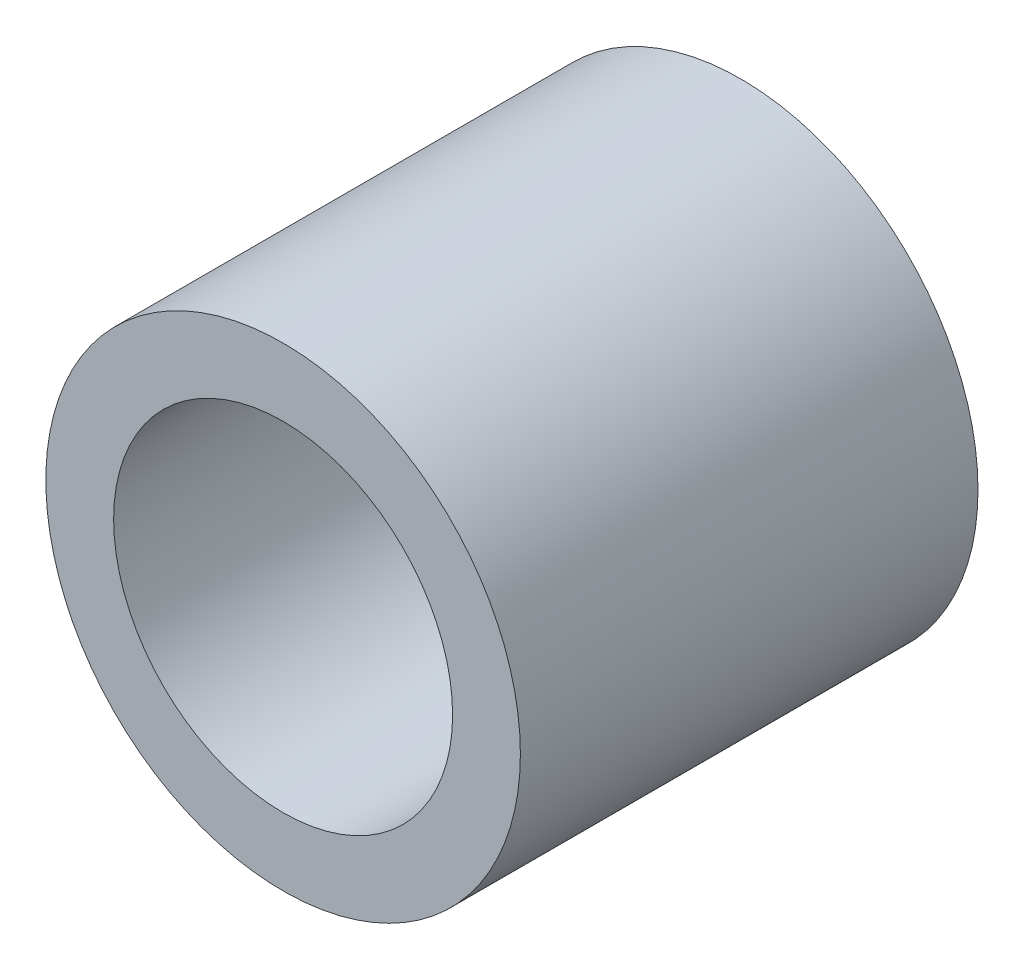
ISO-10303-21;
HEADER;
FILE_DESCRIPTION(('STEP AP214'),'2;1');
FILE_NAME('part.step','',(''),(''),'','','');
FILE_SCHEMA(('AUTOMOTIVE_DESIGN { 1 0 10303 214 1 1 1 1 }'));
ENDSEC;
DATA;
#1=APPLICATION_CONTEXT('core data for automotive mechanical design processes');
#2=APPLICATION_PROTOCOL_DEFINITION('international standard','automotive_design',2000,#1);
#3=PRODUCT_CONTEXT('',#1,'mechanical');
#4=PRODUCT('Part','Part','',(#3));
#5=PRODUCT_RELATED_PRODUCT_CATEGORY('part','',(#4));
#6=PRODUCT_DEFINITION_FORMATION('','',#4);
#7=PRODUCT_DEFINITION_CONTEXT('part definition',#1,'design');
#8=PRODUCT_DEFINITION('design','',#6,#7);
#9=PRODUCT_DEFINITION_SHAPE('','',#8);
#10=(LENGTH_UNIT() NAMED_UNIT(*) SI_UNIT(.MILLI.,.METRE.));
#11=(NAMED_UNIT(*) PLANE_ANGLE_UNIT() SI_UNIT($,.RADIAN.));
#12=(NAMED_UNIT(*) SI_UNIT($,.STERADIAN.) SOLID_ANGLE_UNIT());
#13=UNCERTAINTY_MEASURE_WITH_UNIT(LENGTH_MEASURE(1.E-05),#10,'distance_accuracy_value','');
#14=(GEOMETRIC_REPRESENTATION_CONTEXT(3) GLOBAL_UNCERTAINTY_ASSIGNED_CONTEXT((#13)) GLOBAL_UNIT_ASSIGNED_CONTEXT((#10,
#11,#12)) REPRESENTATION_CONTEXT('',''));
#15=CARTESIAN_POINT('',(0.,0.,0.));
#16=DIRECTION('',(0.,0.,1.));
#17=DIRECTION('',(1.,0.,0.));
#18=AXIS2_PLACEMENT_3D('',#15,#16,#17);
#19=CARTESIAN_POINT('',(0.,0.,6.75));
#20=DIRECTION('',(0.,0.,1.));
#21=DIRECTION('',(1.,0.,0.));
#22=AXIS2_PLACEMENT_3D('',#19,#20,#21);
#23=PLANE('',#22);
#24=CARTESIAN_POINT('',(0.,0.,6.75));
#25=DIRECTION('',(0.,0.,1.));
#26=DIRECTION('',(1.,0.,0.));
#27=AXIS2_PLACEMENT_3D('',#24,#25,#26);
#28=CIRCLE('',#27,3.5);
#29=CARTESIAN_POINT('',(3.5,0.,6.75));
#30=VERTEX_POINT('',#29);
#31=EDGE_CURVE('E10',#30,#30,#28,.T.);
#32=ORIENTED_EDGE('',*,*,#31,.T.);
#33=EDGE_LOOP('',(#32));
#34=FACE_BOUND('',#33,.T.);
#35=CARTESIAN_POINT('',(0.,0.,6.75));
#36=DIRECTION('',(0.,0.,1.));
#37=DIRECTION('',(1.,0.,0.));
#38=AXIS2_PLACEMENT_3D('',#35,#36,#37);
#39=CIRCLE('',#38,2.5);
#40=CARTESIAN_POINT('',(2.5,0.,6.75));
#41=VERTEX_POINT('',#40);
#42=EDGE_CURVE('E41',#41,#41,#39,.T.);
#43=ORIENTED_EDGE('',*,*,#42,.F.);
#44=EDGE_LOOP('',(#43));
#45=FACE_BOUND('',#44,.T.);
#46=ADVANCED_FACE('F30',(#34,#45),#23,.T.);
#47=CARTESIAN_POINT('',(0.,0.,0.));
#48=DIRECTION('',(0.,0.,1.));
#49=DIRECTION('',(1.,0.,0.));
#50=AXIS2_PLACEMENT_3D('',#47,#48,#49);
#51=PLANE('',#50);
#52=CARTESIAN_POINT('',(0.,0.,0.));
#53=DIRECTION('',(0.,0.,1.));
#54=DIRECTION('',(1.,0.,0.));
#55=AXIS2_PLACEMENT_3D('',#52,#53,#54);
#56=CIRCLE('',#55,3.5);
#57=CARTESIAN_POINT('',(3.5,0.,0.));
#58=VERTEX_POINT('',#57);
#59=EDGE_CURVE('E34',#58,#58,#56,.T.);
#60=ORIENTED_EDGE('',*,*,#59,.F.);
#61=EDGE_LOOP('',(#60));
#62=FACE_BOUND('',#61,.T.);
#63=CARTESIAN_POINT('',(0.,0.,0.));
#64=DIRECTION('',(0.,0.,1.));
#65=DIRECTION('',(1.,0.,0.));
#66=AXIS2_PLACEMENT_3D('',#63,#64,#65);
#67=CIRCLE('',#66,2.5);
#68=CARTESIAN_POINT('',(2.5,0.,0.));
#69=VERTEX_POINT('',#68);
#70=EDGE_CURVE('E43',#69,#69,#67,.T.);
#71=ORIENTED_EDGE('',*,*,#70,.T.);
#72=EDGE_LOOP('',(#71));
#73=FACE_BOUND('',#72,.T.);
#74=ADVANCED_FACE('F53',(#62,#73),#51,.F.);
#75=CARTESIAN_POINT('',(0.,0.,6.75));
#76=DIRECTION('',(0.,0.,-1.));
#77=DIRECTION('',(-1.,0.,0.));
#78=AXIS2_PLACEMENT_3D('',#75,#76,#77);
#79=CYLINDRICAL_SURFACE('',#78,3.5);
#80=ORIENTED_EDGE('',*,*,#31,.F.);
#81=EDGE_LOOP('',(#80));
#82=FACE_BOUND('',#81,.T.);
#83=ORIENTED_EDGE('',*,*,#59,.T.);
#84=EDGE_LOOP('',(#83));
#85=FACE_BOUND('',#84,.T.);
#86=ADVANCED_FACE('F32',(#82,#85),#79,.T.);
#87=CARTESIAN_POINT('',(0.,0.,6.75));
#88=DIRECTION('',(0.,0.,-1.));
#89=DIRECTION('',(-1.,0.,0.));
#90=AXIS2_PLACEMENT_3D('',#87,#88,#89);
#91=CYLINDRICAL_SURFACE('',#90,2.5);
#92=ORIENTED_EDGE('',*,*,#42,.T.);
#93=EDGE_LOOP('',(#92));
#94=FACE_BOUND('',#93,.T.);
#95=ORIENTED_EDGE('',*,*,#70,.F.);
#96=EDGE_LOOP('',(#95));
#97=FACE_BOUND('',#96,.T.);
#98=ADVANCED_FACE('F49',(#94,#97),#91,.F.);
#99=CLOSED_SHELL('',(#46,#74,#86,#98));
#100=MANIFOLD_SOLID_BREP('B2',#99);
#101=ADVANCED_BREP_SHAPE_REPRESENTATION('',(#18,#100),#14);
#102=SHAPE_DEFINITION_REPRESENTATION(#9,#101);
ENDSEC;
END-ISO-10303-21;
